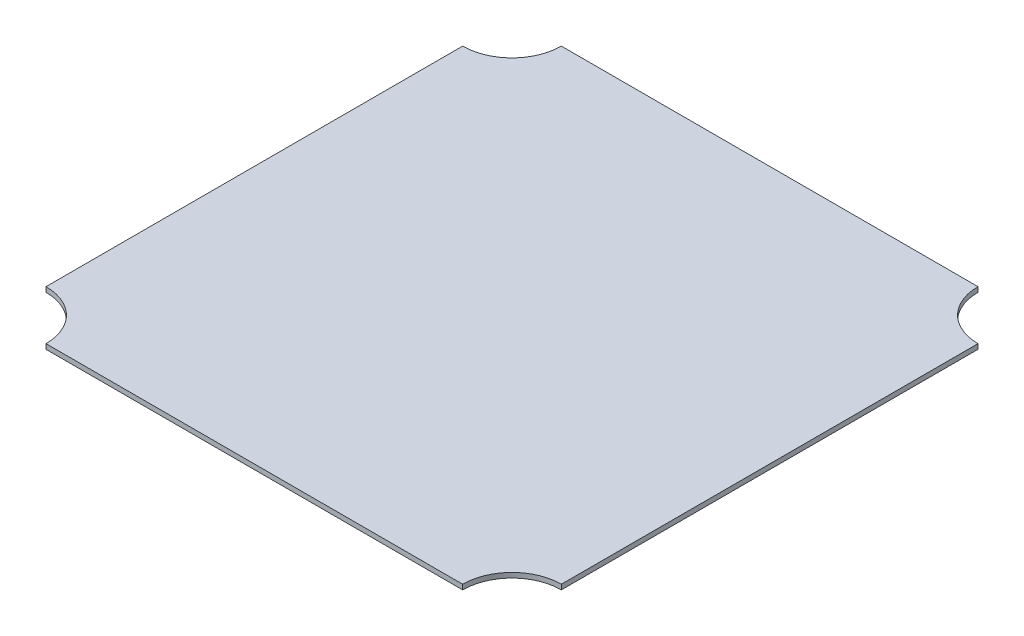
ISO-10303-21;
HEADER;
FILE_DESCRIPTION(('STEP AP214'),'2;1');
FILE_NAME('part.step','',(''),(''),'','','');
FILE_SCHEMA(('AUTOMOTIVE_DESIGN { 1 0 10303 214 1 1 1 1 }'));
ENDSEC;
DATA;
#1=APPLICATION_CONTEXT('core data for automotive mechanical design processes');
#2=APPLICATION_PROTOCOL_DEFINITION('international standard','automotive_design',2000,#1);
#3=PRODUCT_CONTEXT('',#1,'mechanical');
#4=PRODUCT('Part','Part','',(#3));
#5=PRODUCT_RELATED_PRODUCT_CATEGORY('part','',(#4));
#6=PRODUCT_DEFINITION_FORMATION('','',#4);
#7=PRODUCT_DEFINITION_CONTEXT('part definition',#1,'design');
#8=PRODUCT_DEFINITION('design','',#6,#7);
#9=PRODUCT_DEFINITION_SHAPE('','',#8);
#10=(LENGTH_UNIT() NAMED_UNIT(*) SI_UNIT(.MILLI.,.METRE.));
#11=(NAMED_UNIT(*) PLANE_ANGLE_UNIT() SI_UNIT($,.RADIAN.));
#12=(NAMED_UNIT(*) SI_UNIT($,.STERADIAN.) SOLID_ANGLE_UNIT());
#13=UNCERTAINTY_MEASURE_WITH_UNIT(LENGTH_MEASURE(1.E-05),#10,'distance_accuracy_value','');
#14=(GEOMETRIC_REPRESENTATION_CONTEXT(3) GLOBAL_UNCERTAINTY_ASSIGNED_CONTEXT((#13)) GLOBAL_UNIT_ASSIGNED_CONTEXT((#10,
#11,#12)) REPRESENTATION_CONTEXT('',''));
#15=CARTESIAN_POINT('',(0.,0.,0.));
#16=DIRECTION('',(0.,0.,1.));
#17=DIRECTION('',(1.,0.,0.));
#18=AXIS2_PLACEMENT_3D('',#15,#16,#17);
#19=CARTESIAN_POINT('',(-261.,5.,261.));
#20=DIRECTION('',(0.,-1.,0.));
#21=DIRECTION('',(0.,0.,-1.));
#22=AXIS2_PLACEMENT_3D('',#19,#20,#21);
#23=CYLINDRICAL_SURFACE('',#22,50.);
#24=CARTESIAN_POINT('',(-261.,0.,261.));
#25=DIRECTION('',(0.,-1.,0.));
#26=DIRECTION('',(0.,0.,-1.));
#27=AXIS2_PLACEMENT_3D('',#24,#25,#26);
#28=CIRCLE('',#27,50.);
#29=CARTESIAN_POINT('',(-261.,0.,211.));
#30=VERTEX_POINT('',#29);
#31=CARTESIAN_POINT('',(-211.,0.,261.));
#32=VERTEX_POINT('',#31);
#33=EDGE_CURVE('E196',#30,#32,#28,.T.);
#34=ORIENTED_EDGE('',*,*,#33,.T.);
#35=DIRECTION('',(0.,-1.,0.));
#36=VECTOR('',#35,1.);
#37=CARTESIAN_POINT('',(-211.,5.,261.));
#38=LINE('',#37,#36);
#39=CARTESIAN_POINT('',(-211.,5.,261.));
#40=VERTEX_POINT('',#39);
#41=EDGE_CURVE('E12',#40,#32,#38,.T.);
#42=ORIENTED_EDGE('',*,*,#41,.F.);
#43=CARTESIAN_POINT('',(-261.,5.,261.));
#44=DIRECTION('',(0.,-1.,0.));
#45=DIRECTION('',(0.,0.,-1.));
#46=AXIS2_PLACEMENT_3D('',#43,#44,#45);
#47=CIRCLE('',#46,50.);
#48=CARTESIAN_POINT('',(-261.,5.,211.));
#49=VERTEX_POINT('',#48);
#50=EDGE_CURVE('E161',#49,#40,#47,.T.);
#51=ORIENTED_EDGE('',*,*,#50,.F.);
#52=DIRECTION('',(0.,-1.,0.));
#53=VECTOR('',#52,1.);
#54=CARTESIAN_POINT('',(-261.,5.,211.));
#55=LINE('',#54,#53);
#56=EDGE_CURVE('E136',#49,#30,#55,.T.);
#57=ORIENTED_EDGE('',*,*,#56,.T.);
#58=EDGE_LOOP('',(#34,#42,#51,#57));
#59=FACE_BOUND('',#58,.T.);
#60=ADVANCED_FACE('F41',(#59),#23,.F.);
#61=CARTESIAN_POINT('',(-211.,5.,261.));
#62=DIRECTION('',(0.,0.,-1.));
#63=DIRECTION('',(-1.,0.,0.));
#64=AXIS2_PLACEMENT_3D('',#61,#62,#63);
#65=PLANE('',#64);
#66=DIRECTION('',(1.,0.,0.));
#67=VECTOR('',#66,1.);
#68=CARTESIAN_POINT('',(-211.,0.,261.));
#69=LINE('',#68,#67);
#70=CARTESIAN_POINT('',(211.,0.,261.));
#71=VERTEX_POINT('',#70);
#72=EDGE_CURVE('E190',#32,#71,#69,.T.);
#73=ORIENTED_EDGE('',*,*,#72,.T.);
#74=DIRECTION('',(0.,-1.,0.));
#75=VECTOR('',#74,1.);
#76=CARTESIAN_POINT('',(211.,5.,261.));
#77=LINE('',#76,#75);
#78=CARTESIAN_POINT('',(211.,5.,261.));
#79=VERTEX_POINT('',#78);
#80=EDGE_CURVE('E49',#79,#71,#77,.T.);
#81=ORIENTED_EDGE('',*,*,#80,.F.);
#82=DIRECTION('',(1.,0.,0.));
#83=VECTOR('',#82,1.);
#84=CARTESIAN_POINT('',(-211.,5.,261.));
#85=LINE('',#84,#83);
#86=EDGE_CURVE('E100',#40,#79,#85,.T.);
#87=ORIENTED_EDGE('',*,*,#86,.F.);
#88=ORIENTED_EDGE('',*,*,#41,.T.);
#89=EDGE_LOOP('',(#73,#81,#87,#88));
#90=FACE_BOUND('',#89,.T.);
#91=ADVANCED_FACE('F215',(#90),#65,.F.);
#92=CARTESIAN_POINT('',(261.,5.,261.));
#93=DIRECTION('',(0.,-1.,0.));
#94=DIRECTION('',(0.,0.,-1.));
#95=AXIS2_PLACEMENT_3D('',#92,#93,#94);
#96=CYLINDRICAL_SURFACE('',#95,50.);
#97=CARTESIAN_POINT('',(261.,0.,261.));
#98=DIRECTION('',(0.,-1.,0.));
#99=DIRECTION('',(0.,0.,1.));
#100=AXIS2_PLACEMENT_3D('',#97,#98,#99);
#101=CIRCLE('',#100,50.);
#102=CARTESIAN_POINT('',(261.,0.,211.));
#103=VERTEX_POINT('',#102);
#104=EDGE_CURVE('E185',#71,#103,#101,.T.);
#105=ORIENTED_EDGE('',*,*,#104,.T.);
#106=DIRECTION('',(0.,-1.,0.));
#107=VECTOR('',#106,1.);
#108=CARTESIAN_POINT('',(261.,5.,211.));
#109=LINE('',#108,#107);
#110=CARTESIAN_POINT('',(261.,5.,211.));
#111=VERTEX_POINT('',#110);
#112=EDGE_CURVE('E177',#111,#103,#109,.T.);
#113=ORIENTED_EDGE('',*,*,#112,.F.);
#114=CARTESIAN_POINT('',(261.,5.,261.));
#115=DIRECTION('',(0.,-1.,0.));
#116=DIRECTION('',(0.,0.,1.));
#117=AXIS2_PLACEMENT_3D('',#114,#115,#116);
#118=CIRCLE('',#117,50.);
#119=EDGE_CURVE('E153',#79,#111,#118,.T.);
#120=ORIENTED_EDGE('',*,*,#119,.F.);
#121=ORIENTED_EDGE('',*,*,#80,.T.);
#122=EDGE_LOOP('',(#105,#113,#120,#121));
#123=FACE_BOUND('',#122,.T.);
#124=ADVANCED_FACE('F183',(#123),#96,.F.);
#125=CARTESIAN_POINT('',(261.,5.,211.));
#126=DIRECTION('',(-1.,0.,0.));
#127=DIRECTION('',(0.,0.,1.));
#128=AXIS2_PLACEMENT_3D('',#125,#126,#127);
#129=PLANE('',#128);
#130=DIRECTION('',(0.,0.,-1.));
#131=VECTOR('',#130,1.);
#132=CARTESIAN_POINT('',(261.,0.,211.));
#133=LINE('',#132,#131);
#134=CARTESIAN_POINT('',(261.,0.,-211.));
#135=VERTEX_POINT('',#134);
#136=EDGE_CURVE('E192',#103,#135,#133,.T.);
#137=ORIENTED_EDGE('',*,*,#136,.T.);
#138=DIRECTION('',(0.,-1.,0.));
#139=VECTOR('',#138,1.);
#140=CARTESIAN_POINT('',(261.,5.,-211.));
#141=LINE('',#140,#139);
#142=CARTESIAN_POINT('',(261.,5.,-211.));
#143=VERTEX_POINT('',#142);
#144=EDGE_CURVE('E174',#143,#135,#141,.T.);
#145=ORIENTED_EDGE('',*,*,#144,.F.);
#146=DIRECTION('',(0.,0.,-1.));
#147=VECTOR('',#146,1.);
#148=CARTESIAN_POINT('',(261.,5.,211.));
#149=LINE('',#148,#147);
#150=EDGE_CURVE('E149',#111,#143,#149,.T.);
#151=ORIENTED_EDGE('',*,*,#150,.F.);
#152=ORIENTED_EDGE('',*,*,#112,.T.);
#153=EDGE_LOOP('',(#137,#145,#151,#152));
#154=FACE_BOUND('',#153,.T.);
#155=ADVANCED_FACE('F222',(#154),#129,.F.);
#156=CARTESIAN_POINT('',(261.,5.,-261.));
#157=DIRECTION('',(0.,-1.,0.));
#158=DIRECTION('',(0.,0.,-1.));
#159=AXIS2_PLACEMENT_3D('',#156,#157,#158);
#160=CYLINDRICAL_SURFACE('',#159,50.);
#161=CARTESIAN_POINT('',(261.,0.,-261.));
#162=DIRECTION('',(0.,-1.,0.));
#163=DIRECTION('',(0.,0.,-1.));
#164=AXIS2_PLACEMENT_3D('',#161,#162,#163);
#165=CIRCLE('',#164,50.);
#166=CARTESIAN_POINT('',(211.,0.,-261.));
#167=VERTEX_POINT('',#166);
#168=EDGE_CURVE('E194',#135,#167,#165,.T.);
#169=ORIENTED_EDGE('',*,*,#168,.T.);
#170=DIRECTION('',(0.,-1.,0.));
#171=VECTOR('',#170,1.);
#172=CARTESIAN_POINT('',(211.,5.,-261.));
#173=LINE('',#172,#171);
#174=CARTESIAN_POINT('',(211.,5.,-261.));
#175=VERTEX_POINT('',#174);
#176=EDGE_CURVE('E129',#175,#167,#173,.T.);
#177=ORIENTED_EDGE('',*,*,#176,.F.);
#178=CARTESIAN_POINT('',(261.,5.,-261.));
#179=DIRECTION('',(0.,-1.,0.));
#180=DIRECTION('',(0.,0.,-1.));
#181=AXIS2_PLACEMENT_3D('',#178,#179,#180);
#182=CIRCLE('',#181,50.);
#183=EDGE_CURVE('E119',#143,#175,#182,.T.);
#184=ORIENTED_EDGE('',*,*,#183,.F.);
#185=ORIENTED_EDGE('',*,*,#144,.T.);
#186=EDGE_LOOP('',(#169,#177,#184,#185));
#187=FACE_BOUND('',#186,.T.);
#188=ADVANCED_FACE('F200',(#187),#160,.F.);
#189=CARTESIAN_POINT('',(-211.,5.,-261.));
#190=DIRECTION('',(0.,0.,1.));
#191=DIRECTION('',(1.,0.,0.));
#192=AXIS2_PLACEMENT_3D('',#189,#190,#191);
#193=PLANE('',#192);
#194=DIRECTION('',(-1.,0.,0.));
#195=VECTOR('',#194,1.);
#196=CARTESIAN_POINT('',(-211.,0.,-261.));
#197=LINE('',#196,#195);
#198=CARTESIAN_POINT('',(-211.,0.,-261.));
#199=VERTEX_POINT('',#198);
#200=EDGE_CURVE('E128',#167,#199,#197,.T.);
#201=ORIENTED_EDGE('',*,*,#200,.T.);
#202=DIRECTION('',(0.,-1.,0.));
#203=VECTOR('',#202,1.);
#204=CARTESIAN_POINT('',(-211.,5.,-261.));
#205=LINE('',#204,#203);
#206=CARTESIAN_POINT('',(-211.,5.,-261.));
#207=VERTEX_POINT('',#206);
#208=EDGE_CURVE('E125',#207,#199,#205,.T.);
#209=ORIENTED_EDGE('',*,*,#208,.F.);
#210=DIRECTION('',(-1.,0.,0.));
#211=VECTOR('',#210,1.);
#212=CARTESIAN_POINT('',(-211.,5.,-261.));
#213=LINE('',#212,#211);
#214=EDGE_CURVE('E113',#175,#207,#213,.T.);
#215=ORIENTED_EDGE('',*,*,#214,.F.);
#216=ORIENTED_EDGE('',*,*,#176,.T.);
#217=EDGE_LOOP('',(#201,#209,#215,#216));
#218=FACE_BOUND('',#217,.T.);
#219=ADVANCED_FACE('F126',(#218),#193,.F.);
#220=CARTESIAN_POINT('',(-261.,5.,-261.));
#221=DIRECTION('',(0.,-1.,0.));
#222=DIRECTION('',(0.,0.,-1.));
#223=AXIS2_PLACEMENT_3D('',#220,#221,#222);
#224=CYLINDRICAL_SURFACE('',#223,50.);
#225=CARTESIAN_POINT('',(-261.,0.,-261.));
#226=DIRECTION('',(0.,-1.,0.));
#227=DIRECTION('',(0.,0.,1.));
#228=AXIS2_PLACEMENT_3D('',#225,#226,#227);
#229=CIRCLE('',#228,50.);
#230=CARTESIAN_POINT('',(-261.,0.,-211.));
#231=VERTEX_POINT('',#230);
#232=EDGE_CURVE('E86',#199,#231,#229,.T.);
#233=ORIENTED_EDGE('',*,*,#232,.T.);
#234=DIRECTION('',(0.,-1.,0.));
#235=VECTOR('',#234,1.);
#236=CARTESIAN_POINT('',(-261.,5.,-211.));
#237=LINE('',#236,#235);
#238=CARTESIAN_POINT('',(-261.,5.,-211.));
#239=VERTEX_POINT('',#238);
#240=EDGE_CURVE('E130',#239,#231,#237,.T.);
#241=ORIENTED_EDGE('',*,*,#240,.F.);
#242=CARTESIAN_POINT('',(-261.,5.,-261.));
#243=DIRECTION('',(0.,-1.,0.));
#244=DIRECTION('',(0.,0.,1.));
#245=AXIS2_PLACEMENT_3D('',#242,#243,#244);
#246=CIRCLE('',#245,50.);
#247=EDGE_CURVE('E117',#207,#239,#246,.T.);
#248=ORIENTED_EDGE('',*,*,#247,.F.);
#249=ORIENTED_EDGE('',*,*,#208,.T.);
#250=EDGE_LOOP('',(#233,#241,#248,#249));
#251=FACE_BOUND('',#250,.T.);
#252=ADVANCED_FACE('F132',(#251),#224,.F.);
#253=CARTESIAN_POINT('',(-261.,5.,211.));
#254=DIRECTION('',(1.,0.,0.));
#255=DIRECTION('',(0.,0.,-1.));
#256=AXIS2_PLACEMENT_3D('',#253,#254,#255);
#257=PLANE('',#256);
#258=DIRECTION('',(0.,0.,1.));
#259=VECTOR('',#258,1.);
#260=CARTESIAN_POINT('',(-261.,0.,211.));
#261=LINE('',#260,#259);
#262=EDGE_CURVE('E92',#231,#30,#261,.T.);
#263=ORIENTED_EDGE('',*,*,#262,.T.);
#264=ORIENTED_EDGE('',*,*,#56,.F.);
#265=DIRECTION('',(0.,0.,1.));
#266=VECTOR('',#265,1.);
#267=CARTESIAN_POINT('',(-261.,5.,211.));
#268=LINE('',#267,#266);
#269=EDGE_CURVE('E57',#239,#49,#268,.T.);
#270=ORIENTED_EDGE('',*,*,#269,.F.);
#271=ORIENTED_EDGE('',*,*,#240,.T.);
#272=EDGE_LOOP('',(#263,#264,#270,#271));
#273=FACE_BOUND('',#272,.T.);
#274=ADVANCED_FACE('F204',(#273),#257,.F.);
#275=CARTESIAN_POINT('',(-261.,5.,261.));
#276=DIRECTION('',(0.,-1.,0.));
#277=DIRECTION('',(0.,0.,-1.));
#278=AXIS2_PLACEMENT_3D('',#275,#276,#277);
#279=PLANE('',#278);
#280=ORIENTED_EDGE('',*,*,#50,.T.);
#281=ORIENTED_EDGE('',*,*,#86,.T.);
#282=ORIENTED_EDGE('',*,*,#119,.T.);
#283=ORIENTED_EDGE('',*,*,#150,.T.);
#284=ORIENTED_EDGE('',*,*,#183,.T.);
#285=ORIENTED_EDGE('',*,*,#214,.T.);
#286=ORIENTED_EDGE('',*,*,#247,.T.);
#287=ORIENTED_EDGE('',*,*,#269,.T.);
#288=EDGE_LOOP('',(#280,#281,#282,#283,#284,#285,#286,#287));
#289=FACE_BOUND('',#288,.T.);
#290=ADVANCED_FACE('F115',(#289),#279,.F.);
#291=CARTESIAN_POINT('',(-261.,0.,261.));
#292=DIRECTION('',(0.,-1.,0.));
#293=DIRECTION('',(0.,0.,-1.));
#294=AXIS2_PLACEMENT_3D('',#291,#292,#293);
#295=PLANE('',#294);
#296=ORIENTED_EDGE('',*,*,#33,.F.);
#297=ORIENTED_EDGE('',*,*,#262,.F.);
#298=ORIENTED_EDGE('',*,*,#232,.F.);
#299=ORIENTED_EDGE('',*,*,#200,.F.);
#300=ORIENTED_EDGE('',*,*,#168,.F.);
#301=ORIENTED_EDGE('',*,*,#136,.F.);
#302=ORIENTED_EDGE('',*,*,#104,.F.);
#303=ORIENTED_EDGE('',*,*,#72,.F.);
#304=EDGE_LOOP('',(#296,#297,#298,#299,#300,#301,#302,#303));
#305=FACE_BOUND('',#304,.T.);
#306=ADVANCED_FACE('F189',(#305),#295,.T.);
#307=CLOSED_SHELL('',(#60,#91,#124,#155,#188,#219,#252,#274,#290,#306));
#308=MANIFOLD_SOLID_BREP('B2',#307);
#309=ADVANCED_BREP_SHAPE_REPRESENTATION('',(#18,#308),#14);
#310=SHAPE_DEFINITION_REPRESENTATION(#9,#309);
ENDSEC;
END-ISO-10303-21;
